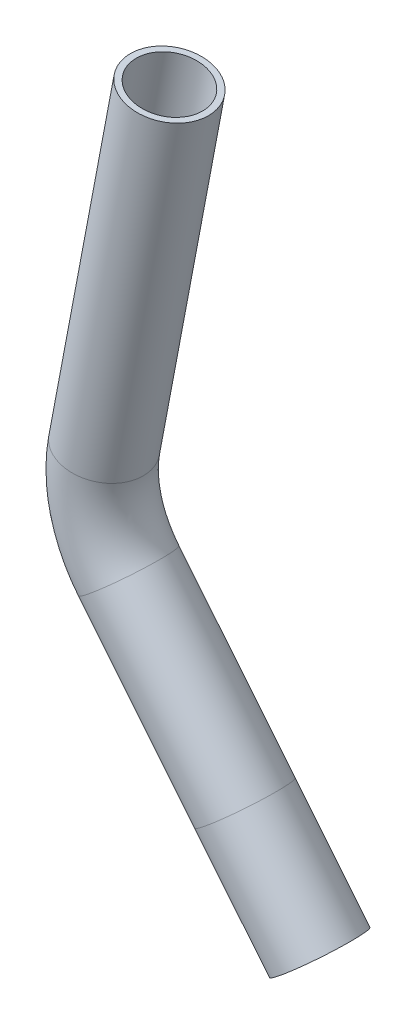
ISO-10303-21;
HEADER;
FILE_DESCRIPTION(('STEP AP214'),'2;1');
FILE_NAME('part.step','',(''),(''),'','','');
FILE_SCHEMA(('AUTOMOTIVE_DESIGN { 1 0 10303 214 1 1 1 1 }'));
ENDSEC;
DATA;
#1=APPLICATION_CONTEXT('core data for automotive mechanical design processes');
#2=APPLICATION_PROTOCOL_DEFINITION('international standard','automotive_design',2000,#1);
#3=PRODUCT_CONTEXT('',#1,'mechanical');
#4=PRODUCT('Part','Part','',(#3));
#5=PRODUCT_RELATED_PRODUCT_CATEGORY('part','',(#4));
#6=PRODUCT_DEFINITION_FORMATION('','',#4);
#7=PRODUCT_DEFINITION_CONTEXT('part definition',#1,'design');
#8=PRODUCT_DEFINITION('design','',#6,#7);
#9=PRODUCT_DEFINITION_SHAPE('','',#8);
#10=(LENGTH_UNIT() NAMED_UNIT(*) SI_UNIT(.MILLI.,.METRE.));
#11=(NAMED_UNIT(*) PLANE_ANGLE_UNIT() SI_UNIT($,.RADIAN.));
#12=(NAMED_UNIT(*) SI_UNIT($,.STERADIAN.) SOLID_ANGLE_UNIT());
#13=UNCERTAINTY_MEASURE_WITH_UNIT(LENGTH_MEASURE(1.E-05),#10,'distance_accuracy_value','');
#14=(GEOMETRIC_REPRESENTATION_CONTEXT(3) GLOBAL_UNCERTAINTY_ASSIGNED_CONTEXT((#13)) GLOBAL_UNIT_ASSIGNED_CONTEXT((#10,
#11,#12)) REPRESENTATION_CONTEXT('',''));
#15=CARTESIAN_POINT('',(0.,0.,0.));
#16=DIRECTION('',(0.,0.,1.));
#17=DIRECTION('',(1.,0.,0.));
#18=AXIS2_PLACEMENT_3D('',#15,#16,#17);
#19=CARTESIAN_POINT('',(-12.6705902595337,57.0464869394673,0.));
#20=DIRECTION('',(-0.186016121361984,-0.982546692322275,0.));
#21=DIRECTION('',(0.982546692322275,-0.186016121361984,0.));
#22=AXIS2_PLACEMENT_3D('',#19,#20,#21);
#23=CYLINDRICAL_SURFACE('',#22,3.35);
#24=CARTESIAN_POINT('',(-18.1715152174962,27.9903192127936,0.));
#25=DIRECTION('',(-0.186016121361984,-0.982546692322275,0.));
#26=DIRECTION('',(0.982546692322275,-0.186016121361984,0.));
#27=AXIS2_PLACEMENT_3D('',#24,#25,#26);
#28=CIRCLE('',#27,3.35);
#29=CARTESIAN_POINT('',(-21.4630466367758,28.6134732193562,0.));
#30=VERTEX_POINT('',#29);
#31=EDGE_CURVE('E82',#30,#30,#28,.T.);
#32=ORIENTED_EDGE('',*,*,#31,.F.);
#33=EDGE_LOOP('',(#32));
#34=FACE_BOUND('',#33,.T.);
#35=CARTESIAN_POINT('',(-12.6705902595337,57.0464869394673,0.));
#36=DIRECTION('',(-0.186016121361984,-0.982546692322275,0.));
#37=DIRECTION('',(0.982546692322275,-0.186016121361984,0.));
#38=AXIS2_PLACEMENT_3D('',#35,#36,#37);
#39=CIRCLE('',#38,3.35);
#40=CARTESIAN_POINT('',(-9.37905884025403,56.4233329329046,0.));
#41=VERTEX_POINT('',#40);
#42=EDGE_CURVE('E49',#41,#41,#39,.T.);
#43=ORIENTED_EDGE('',*,*,#42,.T.);
#44=EDGE_LOOP('',(#43));
#45=FACE_BOUND('',#44,.T.);
#46=ADVANCED_FACE('F34',(#34,#45),#23,.T.);
#47=CARTESIAN_POINT('',(-8.34604829427341,26.1301579991737,0.));
#48=DIRECTION('',(0.,0.,1.));
#49=DIRECTION('',(1.,0.,0.));
#50=AXIS2_PLACEMENT_3D('',#47,#48,#49);
#51=TOROIDAL_SURFACE('',#50,10.,3.35);
#52=CARTESIAN_POINT('',(-16.107188295436,19.824231748229,0.));
#53=DIRECTION('',(0.630592625094466,-0.776114000116266,0.));
#54=DIRECTION('',(0.776114000116266,0.630592625094466,0.));
#55=AXIS2_PLACEMENT_3D('',#52,#53,#54);
#56=CIRCLE('',#55,3.35);
#57=CARTESIAN_POINT('',(-18.7071701958255,17.7117464541625,0.));
#58=VERTEX_POINT('',#57);
#59=EDGE_CURVE('E84',#58,#58,#56,.T.);
#60=CARTESIAN_POINT('',(-8.34604829427341,26.1301579991737,0.));
#61=DIRECTION('',(0.,0.,1.));
#62=DIRECTION('',(1.,0.,0.));
#63=AXIS2_PLACEMENT_3D('',#60,#61,#62);
#64=CIRCLE('',#63,13.35);
#65=EDGE_CURVE('',#30,#58,#64,.T.);
#66=ORIENTED_EDGE('',*,*,#31,.T.);
#67=ORIENTED_EDGE('',*,*,#59,.F.);
#68=ORIENTED_EDGE('',*,*,#65,.T.);
#69=ORIENTED_EDGE('',*,*,#65,.F.);
#70=EDGE_LOOP('',(#66,#68,#67,#69));
#71=FACE_BOUND('',#70,.T.);
#72=ADVANCED_FACE('F94',(#71),#51,.T.);
#73=CARTESIAN_POINT('',(-16.107188295436,19.824231748229,0.));
#74=DIRECTION('',(0.630592625094466,-0.776114000116266,0.));
#75=DIRECTION('',(0.776114000116266,0.630592625094466,0.));
#76=AXIS2_PLACEMENT_3D('',#73,#74,#75);
#77=CYLINDRICAL_SURFACE('',#76,3.35);
#78=CARTESIAN_POINT('',(-6.30592625094465,7.76114000116265,0.));
#79=DIRECTION('',(0.630592625094466,-0.776114000116266,0.));
#80=DIRECTION('',(0.776114000116266,0.630592625094466,0.));
#81=AXIS2_PLACEMENT_3D('',#78,#79,#80);
#82=CIRCLE('',#81,3.35);
#83=CARTESIAN_POINT('',(-3.70594435055516,9.87362529522911,0.));
#84=VERTEX_POINT('',#83);
#85=EDGE_CURVE('E38',#84,#84,#82,.T.);
#86=ORIENTED_EDGE('',*,*,#85,.F.);
#87=EDGE_LOOP('',(#86));
#88=FACE_BOUND('',#87,.T.);
#89=ORIENTED_EDGE('',*,*,#59,.T.);
#90=EDGE_LOOP('',(#89));
#91=FACE_BOUND('',#90,.T.);
#92=ADVANCED_FACE('F92',(#88,#91),#77,.T.);
#93=CARTESIAN_POINT('',(-6.30592625094465,7.76114000116265,0.));
#94=DIRECTION('',(0.630592625094465,-0.776114000116266,0.));
#95=DIRECTION('',(0.776114000116266,0.630592625094465,0.));
#96=AXIS2_PLACEMENT_3D('',#93,#94,#95);
#97=CYLINDRICAL_SURFACE('',#96,3.35);
#98=CARTESIAN_POINT('',(0.,0.,0.));
#99=DIRECTION('',(0.630592625094466,-0.776114000116266,0.));
#100=DIRECTION('',(0.776114000116266,0.630592625094466,0.));
#101=AXIS2_PLACEMENT_3D('',#98,#99,#100);
#102=CIRCLE('',#101,3.35);
#103=CARTESIAN_POINT('',(2.59998190038949,2.11248529406646,0.));
#104=VERTEX_POINT('',#103);
#105=EDGE_CURVE('E54',#104,#104,#102,.T.);
#106=ORIENTED_EDGE('',*,*,#105,.F.);
#107=EDGE_LOOP('',(#106));
#108=FACE_BOUND('',#107,.T.);
#109=ORIENTED_EDGE('',*,*,#85,.T.);
#110=EDGE_LOOP('',(#109));
#111=FACE_BOUND('',#110,.T.);
#112=ADVANCED_FACE('F36',(#108,#111),#97,.T.);
#113=CARTESIAN_POINT('',(-12.6705902595337,57.0464869394673,0.));
#114=DIRECTION('',(-0.186016121361984,-0.982546692322275,0.));
#115=DIRECTION('',(0.982546692322275,-0.186016121361984,0.));
#116=AXIS2_PLACEMENT_3D('',#113,#114,#115);
#117=PLANE('',#116);
#118=CARTESIAN_POINT('',(-12.6705902595337,57.0464869394673,0.));
#119=DIRECTION('',(-0.186016121361984,-0.982546692322275,0.));
#120=DIRECTION('',(0.982546692322275,-0.186016121361984,0.));
#121=AXIS2_PLACEMENT_3D('',#118,#119,#120);
#122=CIRCLE('',#121,2.85);
#123=CARTESIAN_POINT('',(-9.87033218641517,56.5163409935856,0.));
#124=VERTEX_POINT('',#123);
#125=EDGE_CURVE('E80',#124,#124,#122,.F.);
#126=ORIENTED_EDGE('',*,*,#125,.F.);
#127=EDGE_LOOP('',(#126));
#128=FACE_BOUND('',#127,.T.);
#129=ORIENTED_EDGE('',*,*,#42,.F.);
#130=EDGE_LOOP('',(#129));
#131=FACE_BOUND('',#130,.T.);
#132=ADVANCED_FACE('F99',(#128,#131),#117,.F.);
#133=CARTESIAN_POINT('',(0.,0.,0.));
#134=DIRECTION('',(0.630592625094466,-0.776114000116266,0.));
#135=DIRECTION('',(0.776114000116266,0.630592625094466,0.));
#136=AXIS2_PLACEMENT_3D('',#133,#134,#135);
#137=PLANE('',#136);
#138=CARTESIAN_POINT('',(0.,0.,0.));
#139=DIRECTION('',(0.630592625094466,-0.776114000116266,0.));
#140=DIRECTION('',(0.776114000116266,0.630592625094466,0.));
#141=AXIS2_PLACEMENT_3D('',#138,#139,#140);
#142=CIRCLE('',#141,2.85);
#143=CARTESIAN_POINT('',(2.21192490033136,1.79718898151923,0.));
#144=VERTEX_POINT('',#143);
#145=EDGE_CURVE('E11',#144,#144,#142,.F.);
#146=ORIENTED_EDGE('',*,*,#145,.T.);
#147=EDGE_LOOP('',(#146));
#148=FACE_BOUND('',#147,.T.);
#149=ORIENTED_EDGE('',*,*,#105,.T.);
#150=EDGE_LOOP('',(#149));
#151=FACE_BOUND('',#150,.T.);
#152=ADVANCED_FACE('F61',(#148,#151),#137,.T.);
#153=CARTESIAN_POINT('',(-12.6705902595337,57.0464869394673,0.));
#154=DIRECTION('',(-0.186016121361984,-0.982546692322275,0.));
#155=DIRECTION('',(0.982546692322275,-0.186016121361984,0.));
#156=AXIS2_PLACEMENT_3D('',#153,#154,#155);
#157=CYLINDRICAL_SURFACE('',#156,2.85);
#158=CARTESIAN_POINT('',(-18.1715152174962,27.9903192127936,0.));
#159=DIRECTION('',(-0.186016121361984,-0.982546692322275,0.));
#160=DIRECTION('',(0.982546692322275,-0.186016121361984,0.));
#161=AXIS2_PLACEMENT_3D('',#158,#159,#160);
#162=CIRCLE('',#161,2.85);
#163=CARTESIAN_POINT('',(-20.9717732906146,28.5204651586752,0.));
#164=VERTEX_POINT('',#163);
#165=EDGE_CURVE('E75',#164,#164,#162,.F.);
#166=ORIENTED_EDGE('',*,*,#165,.F.);
#167=EDGE_LOOP('',(#166));
#168=FACE_BOUND('',#167,.T.);
#169=ORIENTED_EDGE('',*,*,#125,.T.);
#170=EDGE_LOOP('',(#169));
#171=FACE_BOUND('',#170,.T.);
#172=ADVANCED_FACE('F110',(#168,#171),#157,.F.);
#173=CARTESIAN_POINT('',(-8.34604829427341,26.1301579991737,0.));
#174=DIRECTION('',(0.,0.,1.));
#175=DIRECTION('',(1.,0.,0.));
#176=AXIS2_PLACEMENT_3D('',#173,#174,#175);
#177=TOROIDAL_SURFACE('',#176,10.,2.85);
#178=CARTESIAN_POINT('',(-16.107188295436,19.824231748229,0.));
#179=DIRECTION('',(0.630592625094466,-0.776114000116266,0.));
#180=DIRECTION('',(0.776114000116266,0.630592625094466,0.));
#181=AXIS2_PLACEMENT_3D('',#178,#179,#180);
#182=CIRCLE('',#181,2.85);
#183=CARTESIAN_POINT('',(-18.3191131957674,18.0270427667098,0.));
#184=VERTEX_POINT('',#183);
#185=EDGE_CURVE('E72',#184,#184,#182,.F.);
#186=CARTESIAN_POINT('',(-8.34604829427341,26.1301579991737,0.));
#187=DIRECTION('',(0.,0.,1.));
#188=DIRECTION('',(1.,0.,0.));
#189=AXIS2_PLACEMENT_3D('',#186,#187,#188);
#190=CIRCLE('',#189,12.85);
#191=EDGE_CURVE('',#164,#184,#190,.T.);
#192=ORIENTED_EDGE('',*,*,#165,.T.);
#193=ORIENTED_EDGE('',*,*,#185,.F.);
#194=ORIENTED_EDGE('',*,*,#191,.T.);
#195=ORIENTED_EDGE('',*,*,#191,.F.);
#196=EDGE_LOOP('',(#192,#194,#193,#195));
#197=FACE_BOUND('',#196,.T.);
#198=ADVANCED_FACE('F114',(#197),#177,.F.);
#199=CARTESIAN_POINT('',(-16.107188295436,19.824231748229,0.));
#200=DIRECTION('',(0.630592625094466,-0.776114000116266,0.));
#201=DIRECTION('',(0.776114000116266,0.630592625094466,0.));
#202=AXIS2_PLACEMENT_3D('',#199,#200,#201);
#203=CYLINDRICAL_SURFACE('',#202,2.85);
#204=CARTESIAN_POINT('',(-6.30592625094465,7.76114000116265,0.));
#205=DIRECTION('',(0.630592625094466,-0.776114000116266,0.));
#206=DIRECTION('',(0.776114000116266,0.630592625094466,0.));
#207=AXIS2_PLACEMENT_3D('',#204,#205,#206);
#208=CIRCLE('',#207,2.85);
#209=CARTESIAN_POINT('',(-4.09400135061329,9.55832898268188,0.));
#210=VERTEX_POINT('',#209);
#211=EDGE_CURVE('E43',#210,#210,#208,.F.);
#212=ORIENTED_EDGE('',*,*,#211,.F.);
#213=EDGE_LOOP('',(#212));
#214=FACE_BOUND('',#213,.T.);
#215=ORIENTED_EDGE('',*,*,#185,.T.);
#216=EDGE_LOOP('',(#215));
#217=FACE_BOUND('',#216,.T.);
#218=ADVANCED_FACE('F67',(#214,#217),#203,.F.);
#219=CARTESIAN_POINT('',(-6.30592625094465,7.76114000116265,0.));
#220=DIRECTION('',(0.630592625094465,-0.776114000116266,0.));
#221=DIRECTION('',(0.776114000116266,0.630592625094465,0.));
#222=AXIS2_PLACEMENT_3D('',#219,#220,#221);
#223=CYLINDRICAL_SURFACE('',#222,2.85);
#224=ORIENTED_EDGE('',*,*,#145,.F.);
#225=EDGE_LOOP('',(#224));
#226=FACE_BOUND('',#225,.T.);
#227=ORIENTED_EDGE('',*,*,#211,.T.);
#228=EDGE_LOOP('',(#227));
#229=FACE_BOUND('',#228,.T.);
#230=ADVANCED_FACE('F64',(#226,#229),#223,.F.);
#231=CLOSED_SHELL('',(#46,#72,#92,#112,#132,#152,#172,#198,#218,#230));
#232=MANIFOLD_SOLID_BREP('B2',#231);
#233=ADVANCED_BREP_SHAPE_REPRESENTATION('',(#18,#232),#14);
#234=SHAPE_DEFINITION_REPRESENTATION(#9,#233);
ENDSEC;
END-ISO-10303-21;
